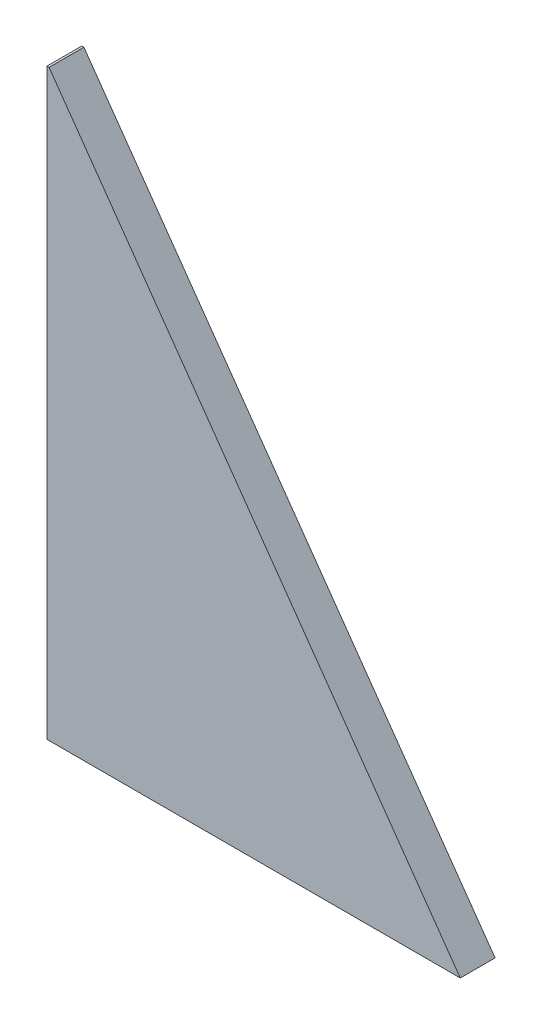
ISO-10303-21;
HEADER;
FILE_DESCRIPTION(('STEP AP214'),'2;1');
FILE_NAME('part.step','',(''),(''),'','','');
FILE_SCHEMA(('AUTOMOTIVE_DESIGN { 1 0 10303 214 1 1 1 1 }'));
ENDSEC;
DATA;
#1=APPLICATION_CONTEXT('core data for automotive mechanical design processes');
#2=APPLICATION_PROTOCOL_DEFINITION('international standard','automotive_design',2000,#1);
#3=PRODUCT_CONTEXT('',#1,'mechanical');
#4=PRODUCT('Part','Part','',(#3));
#5=PRODUCT_RELATED_PRODUCT_CATEGORY('part','',(#4));
#6=PRODUCT_DEFINITION_FORMATION('','',#4);
#7=PRODUCT_DEFINITION_CONTEXT('part definition',#1,'design');
#8=PRODUCT_DEFINITION('design','',#6,#7);
#9=PRODUCT_DEFINITION_SHAPE('','',#8);
#10=(LENGTH_UNIT() NAMED_UNIT(*) SI_UNIT(.MILLI.,.METRE.));
#11=(NAMED_UNIT(*) PLANE_ANGLE_UNIT() SI_UNIT($,.RADIAN.));
#12=(NAMED_UNIT(*) SI_UNIT($,.STERADIAN.) SOLID_ANGLE_UNIT());
#13=UNCERTAINTY_MEASURE_WITH_UNIT(LENGTH_MEASURE(1.E-05),#10,'distance_accuracy_value','');
#14=(GEOMETRIC_REPRESENTATION_CONTEXT(3) GLOBAL_UNCERTAINTY_ASSIGNED_CONTEXT((#13)) GLOBAL_UNIT_ASSIGNED_CONTEXT((#10,
#11,#12)) REPRESENTATION_CONTEXT('',''));
#15=CARTESIAN_POINT('',(0.,0.,0.));
#16=DIRECTION('',(0.,0.,1.));
#17=DIRECTION('',(1.,0.,0.));
#18=AXIS2_PLACEMENT_3D('',#15,#16,#17);
#19=CARTESIAN_POINT('',(190.,0.,16.));
#20=DIRECTION('',(0.,1.,0.));
#21=DIRECTION('',(-1.,0.,0.));
#22=AXIS2_PLACEMENT_3D('',#19,#20,#21);
#23=PLANE('',#22);
#24=DIRECTION('',(1.,0.,0.));
#25=VECTOR('',#24,1.);
#26=CARTESIAN_POINT('',(190.,0.,0.));
#27=LINE('',#26,#25);
#28=CARTESIAN_POINT('',(0.,0.,0.));
#29=VERTEX_POINT('',#28);
#30=CARTESIAN_POINT('',(190.,0.,0.));
#31=VERTEX_POINT('',#30);
#32=EDGE_CURVE('E97',#29,#31,#27,.T.);
#33=ORIENTED_EDGE('',*,*,#32,.T.);
#34=DIRECTION('',(0.,0.,-1.));
#35=VECTOR('',#34,1.);
#36=CARTESIAN_POINT('',(190.,0.,16.));
#37=LINE('',#36,#35);
#38=CARTESIAN_POINT('',(190.,0.,16.));
#39=VERTEX_POINT('',#38);
#40=EDGE_CURVE('E11',#39,#31,#37,.T.);
#41=ORIENTED_EDGE('',*,*,#40,.F.);
#42=DIRECTION('',(1.,0.,0.));
#43=VECTOR('',#42,1.);
#44=CARTESIAN_POINT('',(190.,0.,16.));
#45=LINE('',#44,#43);
#46=CARTESIAN_POINT('',(0.,0.,16.));
#47=VERTEX_POINT('',#46);
#48=EDGE_CURVE('E85',#47,#39,#45,.T.);
#49=ORIENTED_EDGE('',*,*,#48,.F.);
#50=DIRECTION('',(0.,0.,-1.));
#51=VECTOR('',#50,1.);
#52=CARTESIAN_POINT('',(0.,0.,16.));
#53=LINE('',#52,#51);
#54=EDGE_CURVE('E93',#47,#29,#53,.T.);
#55=ORIENTED_EDGE('',*,*,#54,.T.);
#56=EDGE_LOOP('',(#33,#41,#49,#55));
#57=FACE_BOUND('',#56,.T.);
#58=ADVANCED_FACE('F34',(#57),#23,.F.);
#59=CARTESIAN_POINT('',(1.,268.,16.));
#60=DIRECTION('',(-0.817221308558816,-0.576323982528419,0.));
#61=DIRECTION('',(0.576323982528419,-0.817221308558816,0.));
#62=AXIS2_PLACEMENT_3D('',#59,#60,#61);
#63=PLANE('',#62);
#64=DIRECTION('',(-0.576323982528419,0.817221308558816,0.));
#65=VECTOR('',#64,1.);
#66=CARTESIAN_POINT('',(1.,268.,0.));
#67=LINE('',#66,#65);
#68=CARTESIAN_POINT('',(1.,268.,0.));
#69=VERTEX_POINT('',#68);
#70=EDGE_CURVE('E89',#31,#69,#67,.T.);
#71=ORIENTED_EDGE('',*,*,#70,.T.);
#72=DIRECTION('',(0.,0.,-1.));
#73=VECTOR('',#72,1.);
#74=CARTESIAN_POINT('',(1.,268.,16.));
#75=LINE('',#74,#73);
#76=CARTESIAN_POINT('',(1.,268.,16.));
#77=VERTEX_POINT('',#76);
#78=EDGE_CURVE('E42',#77,#69,#75,.T.);
#79=ORIENTED_EDGE('',*,*,#78,.F.);
#80=DIRECTION('',(-0.576323982528419,0.817221308558816,0.));
#81=VECTOR('',#80,1.);
#82=CARTESIAN_POINT('',(1.,268.,16.));
#83=LINE('',#82,#81);
#84=EDGE_CURVE('E80',#39,#77,#83,.T.);
#85=ORIENTED_EDGE('',*,*,#84,.F.);
#86=ORIENTED_EDGE('',*,*,#40,.T.);
#87=EDGE_LOOP('',(#71,#79,#85,#86));
#88=FACE_BOUND('',#87,.T.);
#89=ADVANCED_FACE('F88',(#88),#63,.F.);
#90=CARTESIAN_POINT('',(0.,268.,16.));
#91=DIRECTION('',(0.,-1.,0.));
#92=DIRECTION('',(0.,0.,-1.));
#93=AXIS2_PLACEMENT_3D('',#90,#91,#92);
#94=PLANE('',#93);
#95=DIRECTION('',(-1.,0.,0.));
#96=VECTOR('',#95,1.);
#97=CARTESIAN_POINT('',(0.,268.,0.));
#98=LINE('',#97,#96);
#99=CARTESIAN_POINT('',(0.,268.,0.));
#100=VERTEX_POINT('',#99);
#101=EDGE_CURVE('E67',#69,#100,#98,.T.);
#102=ORIENTED_EDGE('',*,*,#101,.T.);
#103=DIRECTION('',(0.,0.,-1.));
#104=VECTOR('',#103,1.);
#105=CARTESIAN_POINT('',(0.,268.,16.));
#106=LINE('',#105,#104);
#107=CARTESIAN_POINT('',(0.,268.,16.));
#108=VERTEX_POINT('',#107);
#109=EDGE_CURVE('E90',#108,#100,#106,.T.);
#110=ORIENTED_EDGE('',*,*,#109,.F.);
#111=DIRECTION('',(-1.,0.,0.));
#112=VECTOR('',#111,1.);
#113=CARTESIAN_POINT('',(0.,268.,16.));
#114=LINE('',#113,#112);
#115=EDGE_CURVE('E83',#77,#108,#114,.T.);
#116=ORIENTED_EDGE('',*,*,#115,.F.);
#117=ORIENTED_EDGE('',*,*,#78,.T.);
#118=EDGE_LOOP('',(#102,#110,#116,#117));
#119=FACE_BOUND('',#118,.T.);
#120=ADVANCED_FACE('F91',(#119),#94,.F.);
#121=CARTESIAN_POINT('',(0.,0.,16.));
#122=DIRECTION('',(1.,0.,0.));
#123=DIRECTION('',(0.,0.,-1.));
#124=AXIS2_PLACEMENT_3D('',#121,#122,#123);
#125=PLANE('',#124);
#126=DIRECTION('',(0.,-1.,0.));
#127=VECTOR('',#126,1.);
#128=CARTESIAN_POINT('',(0.,0.,0.));
#129=LINE('',#128,#127);
#130=EDGE_CURVE('E73',#100,#29,#129,.T.);
#131=ORIENTED_EDGE('',*,*,#130,.T.);
#132=ORIENTED_EDGE('',*,*,#54,.F.);
#133=DIRECTION('',(0.,-1.,0.));
#134=VECTOR('',#133,1.);
#135=CARTESIAN_POINT('',(0.,0.,16.));
#136=LINE('',#135,#134);
#137=EDGE_CURVE('E50',#108,#47,#136,.T.);
#138=ORIENTED_EDGE('',*,*,#137,.F.);
#139=ORIENTED_EDGE('',*,*,#109,.T.);
#140=EDGE_LOOP('',(#131,#132,#138,#139));
#141=FACE_BOUND('',#140,.T.);
#142=ADVANCED_FACE('F104',(#141),#125,.F.);
#143=CARTESIAN_POINT('',(0.,0.,16.));
#144=DIRECTION('',(0.,0.,-1.));
#145=DIRECTION('',(-1.,0.,0.));
#146=AXIS2_PLACEMENT_3D('',#143,#144,#145);
#147=PLANE('',#146);
#148=ORIENTED_EDGE('',*,*,#48,.T.);
#149=ORIENTED_EDGE('',*,*,#84,.T.);
#150=ORIENTED_EDGE('',*,*,#115,.T.);
#151=ORIENTED_EDGE('',*,*,#137,.T.);
#152=EDGE_LOOP('',(#148,#149,#150,#151));
#153=FACE_BOUND('',#152,.T.);
#154=ADVANCED_FACE('F81',(#153),#147,.F.);
#155=CARTESIAN_POINT('',(0.,0.,0.));
#156=DIRECTION('',(0.,0.,-1.));
#157=DIRECTION('',(-1.,0.,0.));
#158=AXIS2_PLACEMENT_3D('',#155,#156,#157);
#159=PLANE('',#158);
#160=ORIENTED_EDGE('',*,*,#32,.F.);
#161=ORIENTED_EDGE('',*,*,#130,.F.);
#162=ORIENTED_EDGE('',*,*,#101,.F.);
#163=ORIENTED_EDGE('',*,*,#70,.F.);
#164=EDGE_LOOP('',(#160,#161,#162,#163));
#165=FACE_BOUND('',#164,.T.);
#166=ADVANCED_FACE('F107',(#165),#159,.T.);
#167=CLOSED_SHELL('',(#58,#89,#120,#142,#154,#166));
#168=MANIFOLD_SOLID_BREP('B2',#167);
#169=ADVANCED_BREP_SHAPE_REPRESENTATION('',(#18,#168),#14);
#170=SHAPE_DEFINITION_REPRESENTATION(#9,#169);
ENDSEC;
END-ISO-10303-21;
